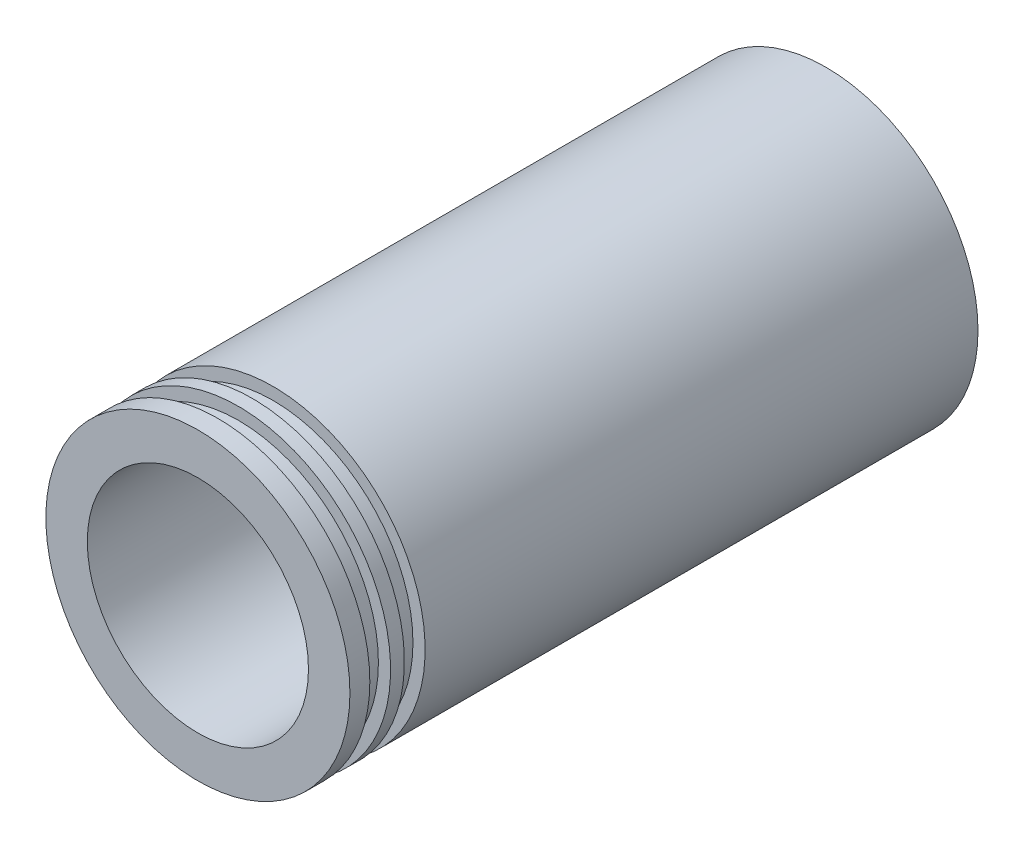
ISO-10303-21;
HEADER;
FILE_DESCRIPTION(('STEP AP214'),'2;1');
FILE_NAME('part.step','',(''),(''),'','','');
FILE_SCHEMA(('AUTOMOTIVE_DESIGN { 1 0 10303 214 1 1 1 1 }'));
ENDSEC;
DATA;
#1=APPLICATION_CONTEXT('core data for automotive mechanical design processes');
#2=APPLICATION_PROTOCOL_DEFINITION('international standard','automotive_design',2000,#1);
#3=PRODUCT_CONTEXT('',#1,'mechanical');
#4=PRODUCT('Part','Part','',(#3));
#5=PRODUCT_RELATED_PRODUCT_CATEGORY('part','',(#4));
#6=PRODUCT_DEFINITION_FORMATION('','',#4);
#7=PRODUCT_DEFINITION_CONTEXT('part definition',#1,'design');
#8=PRODUCT_DEFINITION('design','',#6,#7);
#9=PRODUCT_DEFINITION_SHAPE('','',#8);
#10=(LENGTH_UNIT() NAMED_UNIT(*) SI_UNIT(.MILLI.,.METRE.));
#11=(NAMED_UNIT(*) PLANE_ANGLE_UNIT() SI_UNIT($,.RADIAN.));
#12=(NAMED_UNIT(*) SI_UNIT($,.STERADIAN.) SOLID_ANGLE_UNIT());
#13=UNCERTAINTY_MEASURE_WITH_UNIT(LENGTH_MEASURE(1.E-05),#10,'distance_accuracy_value','');
#14=(GEOMETRIC_REPRESENTATION_CONTEXT(3) GLOBAL_UNCERTAINTY_ASSIGNED_CONTEXT((#13)) GLOBAL_UNIT_ASSIGNED_CONTEXT((#10,
#11,#12)) REPRESENTATION_CONTEXT('',''));
#15=CARTESIAN_POINT('',(0.,0.,0.));
#16=DIRECTION('',(0.,0.,1.));
#17=DIRECTION('',(1.,0.,0.));
#18=AXIS2_PLACEMENT_3D('',#15,#16,#17);
#19=CARTESIAN_POINT('',(0.,0.,144.272));
#20=DIRECTION('',(0.,0.,-1.));
#21=DIRECTION('',(-1.,0.,0.));
#22=AXIS2_PLACEMENT_3D('',#19,#20,#21);
#23=CYLINDRICAL_SURFACE('',#22,34.925);
#24=CARTESIAN_POINT('',(0.,0.,139.7));
#25=DIRECTION('',(0.,0.,1.));
#26=DIRECTION('',(1.,0.,0.));
#27=AXIS2_PLACEMENT_3D('',#24,#25,#26);
#28=CIRCLE('',#27,34.925);
#29=CARTESIAN_POINT('',(34.925,0.,139.7));
#30=VERTEX_POINT('',#29);
#31=EDGE_CURVE('E35',#30,#30,#28,.T.);
#32=ORIENTED_EDGE('',*,*,#31,.T.);
#33=EDGE_LOOP('',(#32));
#34=FACE_BOUND('',#33,.T.);
#35=CARTESIAN_POINT('',(0.,0.,144.272));
#36=DIRECTION('',(0.,0.,1.));
#37=DIRECTION('',(1.,0.,0.));
#38=AXIS2_PLACEMENT_3D('',#35,#36,#37);
#39=CIRCLE('',#38,34.925);
#40=CARTESIAN_POINT('',(34.925,0.,144.272));
#41=VERTEX_POINT('',#40);
#42=EDGE_CURVE('E10',#41,#41,#39,.T.);
#43=ORIENTED_EDGE('',*,*,#42,.F.);
#44=EDGE_LOOP('',(#43));
#45=FACE_BOUND('',#44,.T.);
#46=ADVANCED_FACE('F31',(#34,#45),#23,.T.);
#47=CARTESIAN_POINT('',(0.,0.,144.272));
#48=DIRECTION('',(0.,0.,1.));
#49=DIRECTION('',(1.,0.,0.));
#50=AXIS2_PLACEMENT_3D('',#47,#48,#49);
#51=PLANE('',#50);
#52=ORIENTED_EDGE('',*,*,#42,.T.);
#53=EDGE_LOOP('',(#52));
#54=FACE_BOUND('',#53,.T.);
#55=CARTESIAN_POINT('',(0.,0.,144.272));
#56=DIRECTION('',(0.,0.,1.));
#57=DIRECTION('',(1.,0.,0.));
#58=AXIS2_PLACEMENT_3D('',#55,#56,#57);
#59=CIRCLE('',#58,25.4);
#60=CARTESIAN_POINT('',(25.4,0.,144.272));
#61=VERTEX_POINT('',#60);
#62=EDGE_CURVE('E44',#61,#61,#59,.T.);
#63=ORIENTED_EDGE('',*,*,#62,.F.);
#64=EDGE_LOOP('',(#63));
#65=FACE_BOUND('',#64,.T.);
#66=ADVANCED_FACE('F113',(#54,#65),#51,.T.);
#67=CARTESIAN_POINT('',(0.,0.,0.));
#68=DIRECTION('',(0.,0.,1.));
#69=DIRECTION('',(1.,0.,0.));
#70=AXIS2_PLACEMENT_3D('',#67,#68,#69);
#71=PLANE('',#70);
#72=CARTESIAN_POINT('',(0.,0.,0.));
#73=DIRECTION('',(0.,0.,1.));
#74=DIRECTION('',(1.,0.,0.));
#75=AXIS2_PLACEMENT_3D('',#72,#73,#74);
#76=CIRCLE('',#75,34.925);
#77=CARTESIAN_POINT('',(34.925,0.,0.));
#78=VERTEX_POINT('',#77);
#79=EDGE_CURVE('E39',#78,#78,#76,.T.);
#80=ORIENTED_EDGE('',*,*,#79,.F.);
#81=EDGE_LOOP('',(#80));
#82=FACE_BOUND('',#81,.T.);
#83=CARTESIAN_POINT('',(0.,0.,0.));
#84=DIRECTION('',(0.,0.,1.));
#85=DIRECTION('',(1.,0.,0.));
#86=AXIS2_PLACEMENT_3D('',#83,#84,#85);
#87=CIRCLE('',#86,25.4);
#88=CARTESIAN_POINT('',(25.4,0.,0.));
#89=VERTEX_POINT('',#88);
#90=EDGE_CURVE('E47',#89,#89,#87,.T.);
#91=ORIENTED_EDGE('',*,*,#90,.T.);
#92=EDGE_LOOP('',(#91));
#93=FACE_BOUND('',#92,.T.);
#94=ADVANCED_FACE('F118',(#82,#93),#71,.F.);
#95=CARTESIAN_POINT('',(0.,0.,127.));
#96=DIRECTION('',(0.,0.,-1.));
#97=DIRECTION('',(-1.,0.,0.));
#98=AXIS2_PLACEMENT_3D('',#95,#96,#97);
#99=CIRCLE('',#98,34.925);
#100=CARTESIAN_POINT('',(-34.925,0.,127.));
#101=VERTEX_POINT('',#100);
#102=EDGE_CURVE('E49',#101,#101,#99,.T.);
#103=ORIENTED_EDGE('',*,*,#102,.T.);
#104=EDGE_LOOP('',(#103));
#105=FACE_BOUND('',#104,.T.);
#106=CARTESIAN_POINT('',(0.,-34.925,43.688));
#107=CARTESIAN_POINT('',(-0.155926787585776,-34.9250009590002,43.688002286579));
#108=CARTESIAN_POINT('',(-0.311822178186594,-34.9239538120037,43.6814714803784));
#109=CARTESIAN_POINT('',(-0.622542061686939,-34.9197965416207,43.6554014857494));
#110=CARTESIAN_POINT('',(-0.777366330594077,-34.9166859991733,43.635859654872));
#111=CARTESIAN_POINT('',(-1.08488351979673,-34.9084851466302,43.5838954018838));
#112=CARTESIAN_POINT('',(-1.23757498499888,-34.9033935473551,43.5514645919312));
#113=CARTESIAN_POINT('',(-1.53969953883341,-34.8913716304306,43.4739555949085));
#114=CARTESIAN_POINT('',(-1.68913141053523,-34.8844406383632,43.4288727685946));
#115=CARTESIAN_POINT('',(-1.98345288593516,-34.8689436853213,43.3264624045191));
#116=CARTESIAN_POINT('',(-2.12834760488424,-34.8603796488573,43.269149270558));
#117=CARTESIAN_POINT('',(-2.41282508984259,-34.8418459293962,43.1426442330356));
#118=CARTESIAN_POINT('',(-2.55240587523987,-34.8318757286822,43.0734479523252));
#119=CARTESIAN_POINT('',(-2.82517134944809,-34.8108135014,42.9237271098266));
#120=CARTESIAN_POINT('',(-2.95835923389816,-34.7997220441149,42.8432082886665));
#121=CARTESIAN_POINT('',(-3.21755725629054,-34.7767147395531,42.6713519000818));
#122=CARTESIAN_POINT('',(-3.34356470162769,-34.7647985866837,42.5800103132347));
#123=CARTESIAN_POINT('',(-3.58841735292452,-34.7403819806366,42.3864372094689));
#124=CARTESIAN_POINT('',(-3.7072013476661,-34.7278777973135,42.2841287289942));
#125=CARTESIAN_POINT('',(-3.93579115679,-34.7027146355797,42.0698667076227));
#126=CARTESIAN_POINT('',(-4.04559363155129,-34.6900556015835,41.9579096105473));
#127=CARTESIAN_POINT('',(-4.25538289815559,-34.6649462996975,41.725188989346));
#128=CARTESIAN_POINT('',(-4.35537268694648,-34.6524959690358,41.6044281737751));
#129=CARTESIAN_POINT('',(-4.54491411798442,-34.62814631144,41.3548521720617));
#130=CARTESIAN_POINT('',(-4.63446189674804,-34.6162471894252,41.2260340316688));
#131=CARTESIAN_POINT('',(-4.80288910333002,-34.5932818246241,40.9605662364213));
#132=CARTESIAN_POINT('',(-4.88170956122745,-34.5822203231018,40.8238787418836));
#133=CARTESIAN_POINT('',(-5.02757290880032,-34.5613160409918,40.5442057133));
#134=CARTESIAN_POINT('',(-5.09461140212048,-34.5514737157336,40.401217853104));
#135=CARTESIAN_POINT('',(-5.21635190531759,-34.533304172029,40.1100478182697));
#136=CARTESIAN_POINT('',(-5.27105907300153,-34.5249763204084,39.9618678454075));
#137=CARTESIAN_POINT('',(-5.36777410938295,-34.5100707824586,39.6613184700103));
#138=CARTESIAN_POINT('',(-5.40977733652663,-34.5034937359142,39.5089475583883));
#139=CARTESIAN_POINT('',(-5.51554043972804,-34.4868059885881,39.0499131264788));
#140=CARTESIAN_POINT('',(-5.56023117654726,-34.4795567434403,38.7385008751225));
#141=CARTESIAN_POINT('',(-5.59678123951535,-34.4736416901029,38.1126902872721));
#142=CARTESIAN_POINT('',(-5.5886440126002,-34.474975321895,37.7982921469388));
#143=CARTESIAN_POINT('',(-5.52020063870299,-34.4859996649824,37.178369681281));
#144=CARTESIAN_POINT('',(-5.46038946496932,-34.4956110824807,36.87278950507));
#145=CARTESIAN_POINT('',(-5.2910532450998,-34.52198797609,36.2760704368282));
#146=CARTESIAN_POINT('',(-5.18152661639132,-34.5387536799395,35.9849320048432));
#147=CARTESIAN_POINT('',(-4.91536622923972,-34.5776355082494,35.4238538746498));
#148=CARTESIAN_POINT('',(-4.75852518308302,-34.5997750908992,35.1540141883553));
#149=CARTESIAN_POINT('',(-4.40233412521258,-34.6468938310339,34.6442959772167));
#150=CARTESIAN_POINT('',(-4.20298094616066,-34.6718732000304,34.4044196868882));
#151=CARTESIAN_POINT('',(-3.76471895289522,-34.7222062447451,33.9585689779663));
#152=CARTESIAN_POINT('',(-3.52538497010897,-34.7475609404473,33.7530123750325));
#153=CARTESIAN_POINT('',(-3.01539761289249,-34.7955240014539,33.3849161618899));
#154=CARTESIAN_POINT('',(-2.74474406492233,-34.8181323515395,33.2223767900535));
#155=CARTESIAN_POINT('',(-2.17942027031473,-34.8580838595879,32.9448976760953));
#156=CARTESIAN_POINT('',(-1.88473256273355,-34.8754231455415,32.8299929161321));
#157=CARTESIAN_POINT('',(-1.2799029964699,-34.9028512799961,32.6514223927735));
#158=CARTESIAN_POINT('',(-0.96976233005757,-34.9129406869366,32.5877526828283));
#159=CARTESIAN_POINT('',(-0.346433802646762,-34.9246576359653,32.5140215427636));
#160=CARTESIAN_POINT('',(-0.0333154704977048,-34.9263757646501,32.5033861918782));
#161=CARTESIAN_POINT('',(0.59023074385258,-34.9214040524544,32.5344983554523));
#162=CARTESIAN_POINT('',(0.900658720807009,-34.9147145089103,32.5762440174629));
#163=CARTESIAN_POINT('',(1.50825372271938,-34.8937351440716,32.7104558542442));
#164=CARTESIAN_POINT('',(1.80548468592402,-34.8794876337097,32.8026397555913));
#165=CARTESIAN_POINT('',(2.38027283405258,-34.8449839240621,33.0348118133836));
#166=CARTESIAN_POINT('',(2.65782898627989,-34.8247274096631,33.1748024768823));
#167=CARTESIAN_POINT('',(3.18789435743381,-34.7802294886135,33.4999415651459));
#168=CARTESIAN_POINT('',(3.44017958779795,-34.7559567751963,33.6854507849004));
#169=CARTESIAN_POINT('',(3.91024252981833,-34.7062185056425,34.0958634094541));
#170=CARTESIAN_POINT('',(4.1280179410986,-34.680752870134,34.3207694382872));
#171=CARTESIAN_POINT('',(4.52499111809292,-34.6312081454256,34.806153511419));
#172=CARTESIAN_POINT('',(4.70380235341287,-34.6071445437033,35.0669494767513));
#173=CARTESIAN_POINT('',(5.01507570149491,-34.563412122042,35.6152261915204));
#174=CARTESIAN_POINT('',(5.14753919740565,-34.5437431709604,35.9027061443069));
#175=CARTESIAN_POINT('',(5.36177546050763,-34.5111393873189,36.495020522315));
#176=CARTESIAN_POINT('',(5.44374513872693,-34.4981784276018,36.7997824061363));
#177=CARTESIAN_POINT('',(5.55526986642117,-34.4803991827025,37.4191459285509));
#178=CARTESIAN_POINT('',(5.58482908272962,-34.4755802501993,37.7337467828841));
#179=CARTESIAN_POINT('',(5.58921100271268,-34.4748631809508,38.203891441686));
#180=CARTESIAN_POINT('',(5.58414231355544,-34.4756881748102,38.3594960168491));
#181=CARTESIAN_POINT('',(5.5610543703422,-34.4794210691738,38.6697005286278));
#182=CARTESIAN_POINT('',(5.54303997430065,-34.4823281883369,38.8243008201584));
#183=CARTESIAN_POINT('',(5.49418338552716,-34.4901460364532,39.1314544357116));
#184=CARTESIAN_POINT('',(5.46333659593584,-34.4950574833909,39.2840070059579));
#185=CARTESIAN_POINT('',(5.38906527782191,-34.5067386785422,39.5858899165223));
#186=CARTESIAN_POINT('',(5.34564528488001,-34.5135077565993,39.7352213979608));
#187=CARTESIAN_POINT('',(5.24657785135156,-34.5287062073042,40.029576638385));
#188=CARTESIAN_POINT('',(5.19093821976459,-34.5371345192584,40.1746030816328));
#189=CARTESIAN_POINT('',(5.06784457113818,-34.5554112122003,40.459396428092));
#190=CARTESIAN_POINT('',(5.00039479594469,-34.5652590831017,40.5991651978778));
#191=CARTESIAN_POINT('',(4.85412127734996,-34.5861039771399,40.8725981660315));
#192=CARTESIAN_POINT('',(4.77529312526218,-34.5971014452441,41.0062599716337));
#193=CARTESIAN_POINT('',(4.6068658639177,-34.6199310879884,41.2664715969773));
#194=CARTESIAN_POINT('',(4.51727055655661,-34.6317629673906,41.3930239040637));
#195=CARTESIAN_POINT('',(4.32683134212448,-34.6560740799305,41.6396066777612));
#196=CARTESIAN_POINT('',(4.22587163874389,-34.6685591226056,41.7595471583241));
#197=CARTESIAN_POINT('',(4.01428380761109,-34.6936952973974,41.9904736511026));
#198=CARTESIAN_POINT('',(3.90365915510658,-34.7063463684358,42.1014628545676));
#199=CARTESIAN_POINT('',(3.67340184576359,-34.7314721931615,42.3138352287325));
#200=CARTESIAN_POINT('',(3.5537638453822,-34.7439468369664,42.4152126193766));
#201=CARTESIAN_POINT('',(3.30640488377125,-34.768358440681,42.6075455100697));
#202=CARTESIAN_POINT('',(3.17868692319031,-34.7802955974105,42.6985048442036));
#203=CARTESIAN_POINT('',(2.91512232445285,-34.8033805743508,42.869977740744));
#204=CARTESIAN_POINT('',(2.77922690187682,-34.8145225619298,42.9504171323381));
#205=CARTESIAN_POINT('',(2.50109641187397,-34.835607988603,43.0995149336542));
#206=CARTESIAN_POINT('',(2.35886370024194,-34.8455518680678,43.1681776758966));
#207=CARTESIAN_POINT('',(2.06911442581832,-34.8639561625805,43.2932055512608));
#208=CARTESIAN_POINT('',(1.9216017003025,-34.8724176296361,43.349579412298));
#209=CARTESIAN_POINT('',(1.62230367040308,-34.8876227567975,43.4496521975852));
#210=CARTESIAN_POINT('',(1.47051930715164,-34.89436679205,43.4933538901664));
#211=CARTESIAN_POINT('',(1.10186723777698,-34.9082771518773,43.5827587905394));
#212=CARTESIAN_POINT('',(0.883409229848542,-34.9145194935298,43.6221785257515));
#213=CARTESIAN_POINT('',(0.443279642560445,-34.9228802048972,43.6747973071457));
#214=CARTESIAN_POINT('',(0.22160811189711,-34.9249986370384,43.6879967502412));
#215=CARTESIAN_POINT('',(0.,-34.925,43.688));
#216=B_SPLINE_CURVE_WITH_KNOTS('',3,(#106,#107,#108,#109,#110,#111,#112,#113,#114,#115,#116,
#117,#118,#119,#120,#121,#122,#123,#124,#125,#126,#127,#128,#129,#130,#131,#132,#133,#134,#135,
#136,#137,#138,#139,#140,#141,#142,#143,#144,#145,#146,#147,#148,#149,#150,#151,#152,#153,#154,
#155,#156,#157,#158,#159,#160,#161,#162,#163,#164,#165,#166,#167,#168,#169,#170,#171,#172,#173,
#174,#175,#176,#177,#178,#179,#180,#181,#182,#183,#184,#185,#186,#187,#188,#189,#190,#191,#192,
#193,#194,#195,#196,#197,#198,#199,#200,#201,#202,#203,#204,#205,#206,#207,#208,#209,#210,#211,
#212,#213,#214,#215),.UNSPECIFIED.,.T.,.F.,(4,2,2,2,2,2,2,2,2,2,2,2,2,2,2,2,2,2,2,2,2,2,2,2,2,2,
2,2,2,2,2,2,2,2,2,2,2,2,2,2,2,2,2,2,2,2,2,2,2,2,2,2,2,2,4),(0.,0.467586176287936,
0.935267345070278,1.40325336934529,1.87141121953981,2.33902072710176,2.80680284921926,
3.27434865110587,3.74206864039933,4.21331751988695,4.68474083593324,5.156019720884,
5.62747242671464,6.10142027125178,6.57554459225986,7.04947023240682,7.52356881900327,
8.4626810722473,9.40173205060879,10.3318865581858,11.2620706770839,12.1963906852941,
13.1307803287306,14.0758258112519,15.0208765304676,15.9666200567956,16.9122907271115,
17.8477051024795,18.783086397952,19.713285671149,20.6435337327911,21.5814079689959,
22.5193446963031,23.466200353405,24.4130277512249,25.3561390307485,26.2991753259315,
26.7657884611969,27.2322265862861,27.6988319443491,28.1652691912801,28.6314092228633,
29.0973821732155,29.5635361573617,30.0295260229459,30.5007880191745,30.9718812546288,
31.4432560083116,31.9144567239872,32.3888185632307,32.863005513062,33.3368545764747,
33.8106000458422,34.4751584574673,35.1397068091696),.UNSPECIFIED.);
#217=CARTESIAN_POINT('',(0.,-34.925,43.688));
#218=VERTEX_POINT('',#217);
#219=EDGE_CURVE('E72',#218,#218,#216,.T.);
#220=ORIENTED_EDGE('',*,*,#219,.F.);
#221=EDGE_LOOP('',(#220));
#222=FACE_BOUND('',#221,.T.);
#223=ORIENTED_EDGE('',*,*,#79,.T.);
#224=EDGE_LOOP('',(#223));
#225=FACE_BOUND('',#224,.T.);
#226=ADVANCED_FACE('F33',(#105,#222,#225),#23,.T.);
#227=CARTESIAN_POINT('',(0.,0.,144.272));
#228=DIRECTION('',(0.,0.,-1.));
#229=DIRECTION('',(-1.,0.,0.));
#230=AXIS2_PLACEMENT_3D('',#227,#228,#229);
#231=CYLINDRICAL_SURFACE('',#230,25.4);
#232=CARTESIAN_POINT('',(0.,-25.4,43.688));
#233=CARTESIAN_POINT('',(-0.154991047717078,-25.4000019880151,43.688003623131));
#234=CARTESIAN_POINT('',(-0.309938996560373,-25.3985790351566,43.6815502454012));
#235=CARTESIAN_POINT('',(-0.618757634481485,-25.3929313042532,43.6557967709676));
#236=CARTESIAN_POINT('',(-0.772628160158325,-25.3887061101412,43.6364947665433));
#237=CARTESIAN_POINT('',(-1.07819928230197,-25.3775665304103,43.5851844970218));
#238=CARTESIAN_POINT('',(-1.22989889574632,-25.370650964154,43.5531706533603));
#239=CARTESIAN_POINT('',(-1.53004511449018,-25.3543202932318,43.4766809182158));
#240=CARTESIAN_POINT('',(-1.67849050119274,-25.3449042689708,43.4322004415367));
#241=CARTESIAN_POINT('',(-1.97082295962764,-25.3238485408125,43.3312027653235));
#242=CARTESIAN_POINT('',(-2.11471628263923,-25.3122120558813,43.2747029765404));
#243=CARTESIAN_POINT('',(-2.3972421741321,-25.2870194688099,43.1500320756664));
#244=CARTESIAN_POINT('',(-2.53587277868897,-25.2734626588068,43.0818566578041));
#245=CARTESIAN_POINT('',(-2.80683739967567,-25.2448057987975,42.9343760184233));
#246=CARTESIAN_POINT('',(-2.93917400124833,-25.2297063905482,42.8550754201576));
#247=CARTESIAN_POINT('',(-3.19679512448936,-25.1983600297832,42.6858484576938));
#248=CARTESIAN_POINT('',(-3.32207698052515,-25.1821126486656,42.595918116302));
#249=CARTESIAN_POINT('',(-3.56644710471474,-25.1486755332235,42.4047191723705));
#250=CARTESIAN_POINT('',(-3.68542238453759,-25.1314757045878,42.3033079005655));
#251=CARTESIAN_POINT('',(-3.91448499953045,-25.096817196516,42.0908597665798));
#252=CARTESIAN_POINT('',(-4.02456902308121,-25.0793584234734,41.979819349587));
#253=CARTESIAN_POINT('',(-4.23503610965686,-25.0446769596665,41.74891886165));
#254=CARTESIAN_POINT('',(-4.33542184416311,-25.0274542050169,41.6290612356016));
#255=CARTESIAN_POINT('',(-4.52587911594731,-24.993714766722,41.3812486911215));
#256=CARTESIAN_POINT('',(-4.61594683451026,-24.9771983459002,41.2532908017968));
#257=CARTESIAN_POINT('',(-4.78601467308004,-24.9451725991293,40.9887368910461));
#258=CARTESIAN_POINT('',(-4.86589489383267,-24.9296761516486,40.8520621787893));
#259=CARTESIAN_POINT('',(-5.01386530877727,-24.9003382808448,40.5722381902339));
#260=CARTESIAN_POINT('',(-5.08195106649724,-24.8864974808947,40.4290865030541));
#261=CARTESIAN_POINT('',(-5.20574388494455,-24.8608977547498,40.1374119346101));
#262=CARTESIAN_POINT('',(-5.26145670240002,-24.8491378608966,39.9888915887676));
#263=CARTESIAN_POINT('',(-5.36011444452318,-24.8280422759567,39.6874861818513));
#264=CARTESIAN_POINT('',(-5.40305475869536,-24.818707460405,39.5345995664566));
#265=CARTESIAN_POINT('',(-5.51093613326703,-24.7950646033809,39.0760260925338));
#266=CARTESIAN_POINT('',(-5.55703871690857,-24.7846678042216,38.7654508185471));
#267=CARTESIAN_POINT('',(-5.59661198705608,-24.7757607248019,38.1409852665969));
#268=CARTESIAN_POINT('',(-5.59008922112845,-24.7772489658226,37.8270954058823));
#269=CARTESIAN_POINT('',(-5.52533126229725,-24.7917678633607,37.2108210556785));
#270=CARTESIAN_POINT('',(-5.46805193502244,-24.8045851559434,36.9083311403401));
#271=CARTESIAN_POINT('',(-5.30490248763023,-24.8399860798057,36.3173741513487));
#272=CARTESIAN_POINT('',(-5.19902961283918,-24.8625702647471,36.028907873694));
#273=CARTESIAN_POINT('',(-4.94082796141306,-24.915168615729,35.4714888987783));
#274=CARTESIAN_POINT('',(-4.78813233673096,-24.9452410883712,35.2027118382196));
#275=CARTESIAN_POINT('',(-4.44087619770788,-25.0093923452671,34.6942430660014));
#276=CARTESIAN_POINT('',(-4.24630991359934,-25.0434716813719,34.4545553699762));
#277=CARTESIAN_POINT('',(-3.81577864197343,-25.1127118426778,34.0055642195209));
#278=CARTESIAN_POINT('',(-3.57900083956538,-25.1478800139546,33.7970405139855));
#279=CARTESIAN_POINT('',(-3.07343693804514,-25.2146563760571,33.4225336823534));
#280=CARTESIAN_POINT('',(-2.80465024605423,-25.2462645009214,33.256551344401));
#281=CARTESIAN_POINT('',(-2.24174055892489,-25.3024638686368,32.9716425891604));
#282=CARTESIAN_POINT('',(-1.94756374018349,-25.3270397035968,32.852819281306));
#283=CARTESIAN_POINT('',(-1.3427579308319,-25.3662910545164,32.6665084874429));
#284=CARTESIAN_POINT('',(-1.0321313684078,-25.3809680273018,32.5990134472137));
#285=CARTESIAN_POINT('',(-0.409931279503985,-25.3985602797472,32.5184114264769));
#286=CARTESIAN_POINT('',(-0.098502046991448,-25.40170584325,32.5042394237632));
#287=CARTESIAN_POINT('',(0.522274066772472,-25.3965265795146,32.5277977684126));
#288=CARTESIAN_POINT('',(0.831621089532078,-25.3882025398306,32.5655245521732));
#289=CARTESIAN_POINT('',(1.43591621327802,-25.3611647886906,32.6909265742302));
#290=CARTESIAN_POINT('',(1.73098608572656,-25.3425675097658,32.7780423446108));
#291=CARTESIAN_POINT('',(2.30232456543815,-25.2970652418647,32.9991278479426));
#292=CARTESIAN_POINT('',(2.57859155568667,-25.2701595394776,33.1331016045309));
#293=CARTESIAN_POINT('',(3.10887961162655,-25.2104574198924,33.4463127964475));
#294=CARTESIAN_POINT('',(3.36252266319879,-25.1775816901829,33.6261747771575));
#295=CARTESIAN_POINT('',(3.83640823257327,-25.1097466740042,34.0252364525495));
#296=CARTESIAN_POINT('',(4.05664635123513,-25.0747871139556,34.2444413200645));
#297=CARTESIAN_POINT('',(4.46168821059187,-25.0059276799311,34.720851685156));
#298=CARTESIAN_POINT('',(4.64575407099102,-24.972059751859,34.9786899407087));
#299=CARTESIAN_POINT('',(4.96797437516859,-24.9099633168813,35.5222573865221));
#300=CARTESIAN_POINT('',(5.10613081289001,-24.8817345650756,35.807985364776));
#301=CARTESIAN_POINT('',(5.33167673298088,-24.8343812656595,36.3976245261421));
#302=CARTESIAN_POINT('',(5.41935283602363,-24.8152054309993,36.7014220238565));
#303=CARTESIAN_POINT('',(5.54226999203618,-24.7880487457657,37.3200920256816));
#304=CARTESIAN_POINT('',(5.57751954269228,-24.7800660809319,37.6349627264938));
#305=CARTESIAN_POINT('',(5.59014056936786,-24.7772110622365,38.1045704350543));
#306=CARTESIAN_POINT('',(5.5878725009149,-24.7777262379101,38.2589964781911));
#307=CARTESIAN_POINT('',(5.5705773938566,-24.7816219813482,38.5670801797509));
#308=CARTESIAN_POINT('',(5.55555523417104,-24.7850014534107,38.7207381094));
#309=CARTESIAN_POINT('',(5.51286076009014,-24.7945323016503,39.026240685203));
#310=CARTESIAN_POINT('',(5.48518408414683,-24.8006846335201,39.1780846876319));
#311=CARTESIAN_POINT('',(5.41741794739947,-24.8155754930201,39.4787923845343));
#312=CARTESIAN_POINT('',(5.37733289194892,-24.8243131027493,39.6276571168013));
#313=CARTESIAN_POINT('',(5.28520940878036,-24.844089244522,39.9209497456635));
#314=CARTESIAN_POINT('',(5.23321002510387,-24.8551202502533,40.0653904248266));
#315=CARTESIAN_POINT('',(5.11759900840164,-24.8791813167358,40.3493134028139));
#316=CARTESIAN_POINT('',(5.05399145188652,-24.8922106754579,40.4887974218178));
#317=CARTESIAN_POINT('',(4.91558304295447,-24.9199121913088,40.7620005742113));
#318=CARTESIAN_POINT('',(4.84077738813166,-24.9345850525854,40.8957172023548));
#319=CARTESIAN_POINT('',(4.68054326161314,-24.9651589656846,41.1564131009491));
#320=CARTESIAN_POINT('',(4.59511837481168,-24.9810596023456,41.2833946245294));
#321=CARTESIAN_POINT('',(4.41231629126148,-25.0140013964093,41.5324278364104));
#322=CARTESIAN_POINT('',(4.31472731870972,-25.0310594045754,41.6543218936155));
#323=CARTESIAN_POINT('',(4.10976013498674,-25.0655274167567,41.8894501034553));
#324=CARTESIAN_POINT('',(4.00238533331063,-25.0829372965428,42.0026872471643));
#325=CARTESIAN_POINT('',(3.77846789738961,-25.1176436065124,42.2198621612362));
#326=CARTESIAN_POINT('',(3.6619198858081,-25.1349399636158,42.3237943996116));
#327=CARTESIAN_POINT('',(3.42052827977585,-25.1689259711863,42.5215456159569));
#328=CARTESIAN_POINT('',(3.29568774362887,-25.1856158418523,42.6153682892519));
#329=CARTESIAN_POINT('',(3.03675107023967,-25.2181560569489,42.7934969561782));
#330=CARTESIAN_POINT('',(2.90255232776248,-25.2339919366503,42.8776565408002));
#331=CARTESIAN_POINT('',(2.62741560425557,-25.2641214407243,43.0343170316963));
#332=CARTESIAN_POINT('',(2.48648013059208,-25.2784156325509,43.1068222324886));
#333=CARTESIAN_POINT('',(2.19887783049548,-25.305054206119,43.2396252636728));
#334=CARTESIAN_POINT('',(2.05221415826525,-25.3173996425648,43.299929702368));
#335=CARTESIAN_POINT('',(1.7541847771867,-25.3397945862463,43.4078913438499));
#336=CARTESIAN_POINT('',(1.60281990729239,-25.3498445004862,43.4555507888818));
#337=CARTESIAN_POINT('',(1.21385542459981,-25.3720745338133,43.5600200411844));
#338=CARTESIAN_POINT('',(0.973704632567444,-25.3824882522518,43.6079407135897));
#339=CARTESIAN_POINT('',(0.489000024979896,-25.3964492621167,43.671927114391));
#340=CARTESIAN_POINT('',(0.244446409375627,-25.3999968645727,43.6879942857257));
#341=CARTESIAN_POINT('',(0.,-25.4,43.688));
#342=B_SPLINE_CURVE_WITH_KNOTS('',3,(#232,#233,#234,#235,#236,#237,#238,#239,#240,#241,#242,
#243,#244,#245,#246,#247,#248,#249,#250,#251,#252,#253,#254,#255,#256,#257,#258,#259,#260,#261,
#262,#263,#264,#265,#266,#267,#268,#269,#270,#271,#272,#273,#274,#275,#276,#277,#278,#279,#280,
#281,#282,#283,#284,#285,#286,#287,#288,#289,#290,#291,#292,#293,#294,#295,#296,#297,#298,#299,
#300,#301,#302,#303,#304,#305,#306,#307,#308,#309,#310,#311,#312,#313,#314,#315,#316,#317,#318,
#319,#320,#321,#322,#323,#324,#325,#326,#327,#328,#329,#330,#331,#332,#333,#334,#335,#336,#337,
#338,#339,#340,#341),.UNSPECIFIED.,.T.,.F.,(4,2,2,2,2,2,2,2,2,2,2,2,2,2,2,2,2,2,2,2,2,2,2,2,2,2,
2,2,2,2,2,2,2,2,2,2,2,2,2,2,2,2,2,2,2,2,2,2,2,2,2,2,2,2,4),(0.,0.464758221098885,
0.929585463324635,1.39461691987205,1.85981963876486,2.32435301506536,2.78905807365152,
3.2535705852714,3.71825745100037,4.18953226681656,4.66098181091883,5.13230111747761,
5.60379430037224,6.08040564766109,6.55719588423833,7.03376381884919,7.51050357219012,
8.44793957116316,9.38525893756592,10.3052928626299,11.2253789490695,12.1528663596356,
13.0804816596936,14.0283976066446,14.9763311139245,15.9263259322799,16.8761809083977,
17.806960510077,18.7376762034599,19.6580537733233,20.5785103942751,21.5122333555408,
22.446079173472,23.3973503160353,24.3485801374859,25.2943543429612,26.2399752335923,
26.7028526575218,27.1655530931597,27.6284131250348,28.0911090155772,28.5523097753069,
29.0133488830182,29.4745862809928,29.9356683928097,30.406347929819,30.8768640990698,
31.3476581691133,31.8182795629396,32.2952869262338,32.7721181123588,33.2486903367183,
33.7251779974088,34.4582114646651,35.1912117253176),.UNSPECIFIED.);
#343=CARTESIAN_POINT('',(0.,-25.4,43.688));
#344=VERTEX_POINT('',#343);
#345=EDGE_CURVE('E55',#344,#344,#342,.T.);
#346=ORIENTED_EDGE('',*,*,#345,.T.);
#347=EDGE_LOOP('',(#346));
#348=FACE_BOUND('',#347,.T.);
#349=ORIENTED_EDGE('',*,*,#62,.T.);
#350=EDGE_LOOP('',(#349));
#351=FACE_BOUND('',#350,.T.);
#352=ORIENTED_EDGE('',*,*,#90,.F.);
#353=EDGE_LOOP('',(#352));
#354=FACE_BOUND('',#353,.T.);
#355=ADVANCED_FACE('F122',(#348,#351,#354),#231,.F.);
#356=CARTESIAN_POINT('',(0.,-34.926,38.1));
#357=DIRECTION('',(0.,1.,0.));
#358=DIRECTION('',(0.,0.,1.));
#359=AXIS2_PLACEMENT_3D('',#356,#357,#358);
#360=CYLINDRICAL_SURFACE('',#359,5.588);
#361=ORIENTED_EDGE('',*,*,#345,.F.);
#362=EDGE_LOOP('',(#361));
#363=FACE_BOUND('',#362,.T.);
#364=ORIENTED_EDGE('',*,*,#219,.T.);
#365=EDGE_LOOP('',(#364));
#366=FACE_BOUND('',#365,.T.);
#367=ADVANCED_FACE('F76',(#363,#366),#360,.F.);
#368=CARTESIAN_POINT('',(0.,34.925,131.7625));
#369=DIRECTION('',(0.,0.,1.));
#370=DIRECTION('',(1.,0.,0.));
#371=AXIS2_PLACEMENT_3D('',#368,#369,#370);
#372=PLANE('',#371);
#373=CARTESIAN_POINT('',(0.,0.,131.7625));
#374=DIRECTION('',(0.,0.,-1.));
#375=DIRECTION('',(-1.,0.,0.));
#376=AXIS2_PLACEMENT_3D('',#373,#374,#375);
#377=CIRCLE('',#376,32.131);
#378=CARTESIAN_POINT('',(-32.131,0.,131.7625));
#379=VERTEX_POINT('',#378);
#380=EDGE_CURVE('E228',#379,#379,#377,.T.);
#381=ORIENTED_EDGE('',*,*,#380,.F.);
#382=EDGE_LOOP('',(#381));
#383=FACE_BOUND('',#382,.T.);
#384=CARTESIAN_POINT('',(0.,0.,131.7625));
#385=DIRECTION('',(0.,0.,-1.));
#386=DIRECTION('',(-1.,0.,0.));
#387=AXIS2_PLACEMENT_3D('',#384,#385,#386);
#388=CIRCLE('',#387,34.925);
#389=CARTESIAN_POINT('',(-34.925,0.,131.7625));
#390=VERTEX_POINT('',#389);
#391=EDGE_CURVE('E231',#390,#390,#388,.T.);
#392=ORIENTED_EDGE('',*,*,#391,.T.);
#393=EDGE_LOOP('',(#392));
#394=FACE_BOUND('',#393,.T.);
#395=ADVANCED_FACE('F95',(#383,#394),#372,.F.);
#396=CARTESIAN_POINT('',(0.,0.,131.7625));
#397=DIRECTION('',(0.,0.,-1.));
#398=DIRECTION('',(-1.,0.,0.));
#399=AXIS2_PLACEMENT_3D('',#396,#397,#398);
#400=CYLINDRICAL_SURFACE('',#399,32.131);
#401=CARTESIAN_POINT('',(0.,0.,127.));
#402=DIRECTION('',(0.,0.,-1.));
#403=DIRECTION('',(-1.,0.,0.));
#404=AXIS2_PLACEMENT_3D('',#401,#402,#403);
#405=CIRCLE('',#404,32.131);
#406=CARTESIAN_POINT('',(-32.131,0.,127.));
#407=VERTEX_POINT('',#406);
#408=EDGE_CURVE('E227',#407,#407,#405,.T.);
#409=ORIENTED_EDGE('',*,*,#408,.F.);
#410=EDGE_LOOP('',(#409));
#411=FACE_BOUND('',#410,.T.);
#412=ORIENTED_EDGE('',*,*,#380,.T.);
#413=EDGE_LOOP('',(#412));
#414=FACE_BOUND('',#413,.T.);
#415=ADVANCED_FACE('F98',(#411,#414),#400,.T.);
#416=CARTESIAN_POINT('',(0.,38.1,127.));
#417=DIRECTION('',(0.,0.,-1.));
#418=DIRECTION('',(-1.,0.,0.));
#419=AXIS2_PLACEMENT_3D('',#416,#417,#418);
#420=PLANE('',#419);
#421=ORIENTED_EDGE('',*,*,#408,.T.);
#422=EDGE_LOOP('',(#421));
#423=FACE_BOUND('',#422,.T.);
#424=ORIENTED_EDGE('',*,*,#102,.F.);
#425=EDGE_LOOP('',(#424));
#426=FACE_BOUND('',#425,.T.);
#427=ADVANCED_FACE('F102',(#423,#426),#420,.F.);
#428=CARTESIAN_POINT('',(0.,0.,134.9375));
#429=DIRECTION('',(0.,0.,-1.));
#430=DIRECTION('',(-1.,0.,0.));
#431=AXIS2_PLACEMENT_3D('',#428,#429,#430);
#432=CIRCLE('',#431,34.925);
#433=CARTESIAN_POINT('',(-34.925,0.,134.9375));
#434=VERTEX_POINT('',#433);
#435=EDGE_CURVE('E62',#434,#434,#432,.T.);
#436=ORIENTED_EDGE('',*,*,#435,.T.);
#437=EDGE_LOOP('',(#436));
#438=FACE_BOUND('',#437,.T.);
#439=ORIENTED_EDGE('',*,*,#391,.F.);
#440=EDGE_LOOP('',(#439));
#441=FACE_BOUND('',#440,.T.);
#442=ADVANCED_FACE('F86',(#438,#441),#23,.T.);
#443=CARTESIAN_POINT('',(0.,34.925,139.7));
#444=DIRECTION('',(0.,0.,1.));
#445=DIRECTION('',(1.,0.,0.));
#446=AXIS2_PLACEMENT_3D('',#443,#444,#445);
#447=PLANE('',#446);
#448=CARTESIAN_POINT('',(0.,0.,139.7));
#449=DIRECTION('',(0.,0.,-1.));
#450=DIRECTION('',(-1.,0.,0.));
#451=AXIS2_PLACEMENT_3D('',#448,#449,#450);
#452=CIRCLE('',#451,32.131);
#453=CARTESIAN_POINT('',(-32.131,0.,139.7));
#454=VERTEX_POINT('',#453);
#455=EDGE_CURVE('E51',#454,#454,#452,.T.);
#456=ORIENTED_EDGE('',*,*,#455,.F.);
#457=EDGE_LOOP('',(#456));
#458=FACE_BOUND('',#457,.T.);
#459=ORIENTED_EDGE('',*,*,#31,.F.);
#460=EDGE_LOOP('',(#459));
#461=FACE_BOUND('',#460,.T.);
#462=ADVANCED_FACE('F81',(#458,#461),#447,.F.);
#463=CARTESIAN_POINT('',(0.,0.,131.7625));
#464=DIRECTION('',(0.,0.,-1.));
#465=DIRECTION('',(-1.,0.,0.));
#466=AXIS2_PLACEMENT_3D('',#463,#464,#465);
#467=CYLINDRICAL_SURFACE('',#466,32.131);
#468=CARTESIAN_POINT('',(0.,0.,134.9375));
#469=DIRECTION('',(0.,0.,-1.));
#470=DIRECTION('',(-1.,0.,0.));
#471=AXIS2_PLACEMENT_3D('',#468,#469,#470);
#472=CIRCLE('',#471,32.131);
#473=CARTESIAN_POINT('',(-32.131,0.,134.9375));
#474=VERTEX_POINT('',#473);
#475=EDGE_CURVE('E57',#474,#474,#472,.T.);
#476=ORIENTED_EDGE('',*,*,#475,.F.);
#477=EDGE_LOOP('',(#476));
#478=FACE_BOUND('',#477,.T.);
#479=ORIENTED_EDGE('',*,*,#455,.T.);
#480=EDGE_LOOP('',(#479));
#481=FACE_BOUND('',#480,.T.);
#482=ADVANCED_FACE('F85',(#478,#481),#467,.T.);
#483=CARTESIAN_POINT('',(0.,32.131,134.9375));
#484=DIRECTION('',(0.,0.,-1.));
#485=DIRECTION('',(-1.,0.,0.));
#486=AXIS2_PLACEMENT_3D('',#483,#484,#485);
#487=PLANE('',#486);
#488=ORIENTED_EDGE('',*,*,#435,.F.);
#489=EDGE_LOOP('',(#488));
#490=FACE_BOUND('',#489,.T.);
#491=ORIENTED_EDGE('',*,*,#475,.T.);
#492=EDGE_LOOP('',(#491));
#493=FACE_BOUND('',#492,.T.);
#494=ADVANCED_FACE('F90',(#490,#493),#487,.F.);
#495=CLOSED_SHELL('',(#46,#66,#94,#226,#355,#367,#395,#415,#427,#442,#462,#482,#494));
#496=MANIFOLD_SOLID_BREP('B2',#495);
#497=ADVANCED_BREP_SHAPE_REPRESENTATION('',(#18,#496),#14);
#498=SHAPE_DEFINITION_REPRESENTATION(#9,#497);
ENDSEC;
END-ISO-10303-21;
